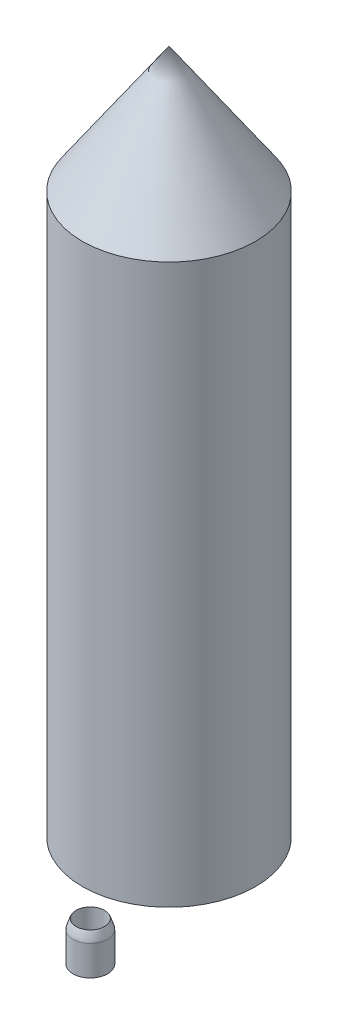
ISO-10303-21;
HEADER;
FILE_DESCRIPTION(('STEP AP214'),'2;1');
FILE_NAME('part.step','',(''),(''),'','','');
FILE_SCHEMA(('AUTOMOTIVE_DESIGN { 1 0 10303 214 1 1 1 1 }'));
ENDSEC;
DATA;
#1=APPLICATION_CONTEXT('core data for automotive mechanical design processes');
#2=APPLICATION_PROTOCOL_DEFINITION('international standard','automotive_design',2000,#1);
#3=PRODUCT_CONTEXT('',#1,'mechanical');
#4=PRODUCT('Part','Part','',(#3));
#5=PRODUCT_RELATED_PRODUCT_CATEGORY('part','',(#4));
#6=PRODUCT_DEFINITION_FORMATION('','',#4);
#7=PRODUCT_DEFINITION_CONTEXT('part definition',#1,'design');
#8=PRODUCT_DEFINITION('design','',#6,#7);
#9=PRODUCT_DEFINITION_SHAPE('','',#8);
#10=(LENGTH_UNIT() NAMED_UNIT(*) SI_UNIT(.MILLI.,.METRE.));
#11=(NAMED_UNIT(*) PLANE_ANGLE_UNIT() SI_UNIT($,.RADIAN.));
#12=(NAMED_UNIT(*) SI_UNIT($,.STERADIAN.) SOLID_ANGLE_UNIT());
#13=UNCERTAINTY_MEASURE_WITH_UNIT(LENGTH_MEASURE(1.E-05),#10,'distance_accuracy_value','');
#14=(GEOMETRIC_REPRESENTATION_CONTEXT(3) GLOBAL_UNCERTAINTY_ASSIGNED_CONTEXT((#13)) GLOBAL_UNIT_ASSIGNED_CONTEXT((#10,
#11,#12)) REPRESENTATION_CONTEXT('',''));
#15=CARTESIAN_POINT('',(0.,0.,0.));
#16=DIRECTION('',(0.,0.,1.));
#17=DIRECTION('',(1.,0.,0.));
#18=AXIS2_PLACEMENT_3D('',#15,#16,#17);
#19=CARTESIAN_POINT('',(0.,-25.,50.));
#20=DIRECTION('',(0.,-1.,0.));
#21=DIRECTION('',(0.,0.,-1.));
#22=AXIS2_PLACEMENT_3D('',#19,#20,#21);
#23=CYLINDRICAL_SURFACE('',#22,11.);
#24=CARTESIAN_POINT('',(0.,-31.0000000000006,61.));
#25=CARTESIAN_POINT('',(1.43989639291298,-31.0000000000006,61.));
#26=CARTESIAN_POINT('',(2.87922694966993,-31.0000000000009,60.7136993515129));
#27=CARTESIAN_POINT('',(5.53980856236204,-31.0000000000004,59.6116503637354));
#28=CARTESIAN_POINT('',(6.76001408941481,-31.0000000000006,58.7963350966893));
#29=CARTESIAN_POINT('',(8.7963350966893,-31.0000000000006,56.7600140894147));
#30=CARTESIAN_POINT('',(9.61165036373382,-31.0000000000006,55.5398085623658));
#31=CARTESIAN_POINT('',(10.7136993515145,-31.0000000000006,52.8792269496662));
#32=CARTESIAN_POINT('',(11.,-31.0000000000006,51.4398963929161));
#33=CARTESIAN_POINT('',(11.,-31.0000000000006,48.5601036070839));
#34=CARTESIAN_POINT('',(10.7136993515122,-31.0000000000004,47.1207730503284));
#35=CARTESIAN_POINT('',(9.61165036373608,-31.0000000000009,44.4601914376396));
#36=CARTESIAN_POINT('',(8.79633509668887,-31.0000000000006,43.2399859105848));
#37=CARTESIAN_POINT('',(6.7600140894151,-31.0000000000006,41.2036649033111));
#38=CARTESIAN_POINT('',(5.53980856236441,-31.0000000000011,40.3883496362656));
#39=CARTESIAN_POINT('',(2.87922694966758,-31.0000000000002,39.2863006484861));
#40=CARTESIAN_POINT('',(1.43989639291256,-31.0000000000006,39.));
#41=CARTESIAN_POINT('',(-1.43989639291256,-31.0000000000006,39.));
#42=CARTESIAN_POINT('',(-2.8792269496686,-31.0000000000009,39.2863006484865));
#43=CARTESIAN_POINT('',(-5.53980856236336,-31.0000000000004,40.3883496362652));
#44=CARTESIAN_POINT('',(-6.76001408941579,-31.0000000000006,41.2036649033117));
#45=CARTESIAN_POINT('',(-8.79633509668834,-31.0000000000006,43.2399859105843));
#46=CARTESIAN_POINT('',(-9.61165036373239,-31.0000000000006,44.4601914376307));
#47=CARTESIAN_POINT('',(-10.7136993515159,-31.0000000000006,47.1207730503373));
#48=CARTESIAN_POINT('',(-11.,-31.0000000000006,48.5601036070895));
#49=CARTESIAN_POINT('',(-11.,-31.0000000000006,51.4398963929105));
#50=CARTESIAN_POINT('',(-10.7136993515139,-31.0000000000004,52.8792269496677));
#51=CARTESIAN_POINT('',(-9.61165036373443,-31.0000000000009,55.5398085623643));
#52=CARTESIAN_POINT('',(-8.79633509668349,-31.0000000000006,56.7600140894206));
#53=CARTESIAN_POINT('',(-6.76001408942064,-31.0000000000006,58.7963350966834));
#54=CARTESIAN_POINT('',(-5.53980856236293,-31.0000000000006,59.611650363735));
#55=CARTESIAN_POINT('',(-2.87922694966907,-31.0000000000006,60.7136993515133));
#56=CARTESIAN_POINT('',(-1.43989639291298,-31.0000000000006,61.));
#57=CARTESIAN_POINT('',(0.,-31.0000000000006,61.));
#58=(BOUNDED_CURVE() B_SPLINE_CURVE(3,(#24,#25,#26,#27,#28,#29,#30,#31,#32,#33,#34,#35,#36,#37,
#38,#39,#40,#41,#42,#43,#44,#45,#46,#47,#48,#49,#50,#51,#52,#53,#54,#55,#56,#57),.UNSPECIFIED.,
.T.,.F.) B_SPLINE_CURVE_WITH_KNOTS((4,2,2,2,2,2,2,2,2,2,2,2,2,2,2,2,4),(0.,0.392699081698724,
0.785398163397448,1.17809724509617,1.5707963267949,1.96349540849362,2.35619449019234,
2.74889357189107,3.14159265358979,3.53429173528852,3.92699081698724,4.31968989868597,
4.71238898038469,5.10508806208341,5.49778714378214,5.89048622548086,6.28318530717959),
.UNSPECIFIED.) CURVE() GEOMETRIC_REPRESENTATION_ITEM() RATIONAL_B_SPLINE_CURVE((1.,1.,1.,1.,1.,
1.,1.,1.,1.,1.,1.,1.,1.,1.,1.,1.,1.,1.,1.,1.,1.,1.,1.,1.,1.,1.,1.,1.,1.,1.,1.,1.,1.,1.)) REPRESENTATION_ITEM(''));
#59=CARTESIAN_POINT('',(0.,-31.0000000000006,61.));
#60=VERTEX_POINT('',#59);
#61=EDGE_CURVE('E12',#60,#60,#58,.F.);
#62=ORIENTED_EDGE('',*,*,#61,.T.);
#63=EDGE_LOOP('',(#62));
#64=FACE_BOUND('',#63,.T.);
#65=CARTESIAN_POINT('',(0.,-50.,50.));
#66=DIRECTION('',(0.,1.,0.));
#67=DIRECTION('',(0.,0.,1.));
#68=AXIS2_PLACEMENT_3D('',#65,#66,#67);
#69=CIRCLE('',#68,11.);
#70=CARTESIAN_POINT('',(0.,-50.,61.));
#71=VERTEX_POINT('',#70);
#72=EDGE_CURVE('E65',#71,#71,#69,.T.);
#73=ORIENTED_EDGE('',*,*,#72,.T.);
#74=EDGE_LOOP('',(#73));
#75=FACE_BOUND('',#74,.T.);
#76=ADVANCED_FACE('F51',(#64,#75),#23,.T.);
#77=CARTESIAN_POINT('',(0.,-50.,50.));
#78=DIRECTION('',(0.,1.,0.));
#79=DIRECTION('',(0.,0.,1.));
#80=AXIS2_PLACEMENT_3D('',#77,#78,#79);
#81=PLANE('',#80);
#82=ORIENTED_EDGE('',*,*,#72,.F.);
#83=EDGE_LOOP('',(#82));
#84=FACE_BOUND('',#83,.T.);
#85=ADVANCED_FACE('F91',(#84),#81,.F.);
#86=CARTESIAN_POINT('',(0.,-25.,50.));
#87=DIRECTION('',(0.,-1.,0.));
#88=DIRECTION('',(0.,0.,-1.));
#89=AXIS2_PLACEMENT_3D('',#86,#87,#88);
#90=CYLINDRICAL_SURFACE('',#89,9.);
#91=CARTESIAN_POINT('',(0.,-25.0000000000002,58.9999999999997));
#92=CARTESIAN_POINT('',(-1.17809704874694,-25.0000000000002,58.9999999999997));
#93=CARTESIAN_POINT('',(-2.35573114063816,-25.0000000000002,58.7657540148737));
#94=CARTESIAN_POINT('',(-4.53257064193324,-25.0000000000002,57.8640775703288));
#95=CARTESIAN_POINT('',(-5.53092061861684,-25.0000000000002,57.1970014427408));
#96=CARTESIAN_POINT('',(-7.19700144274066,-25.0000000000002,55.5309206186166));
#97=CARTESIAN_POINT('',(-7.86407757032794,-25.0000000000002,54.5325706419342));
#98=CARTESIAN_POINT('',(-8.76575401487466,-25.0000000000002,52.3557311406372));
#99=CARTESIAN_POINT('',(-8.9999999999997,-25.0000000000002,51.178097048745));
#100=CARTESIAN_POINT('',(-8.9999999999997,-25.0000000000002,48.8219029512551));
#101=CARTESIAN_POINT('',(-8.76575401487636,-25.0000000000002,47.6442688593669));
#102=CARTESIAN_POINT('',(-7.86407757032624,-25.0000000000002,45.4674293580617));
#103=CARTESIAN_POINT('',(-7.19700144274477,-25.0000000000002,44.4690793813874));
#104=CARTESIAN_POINT('',(-5.53092061861272,-25.0000000000002,42.8029985572552));
#105=CARTESIAN_POINT('',(-4.53257064193349,-25.0000000000002,42.1359224296713));
#106=CARTESIAN_POINT('',(-2.35573114063789,-25.0000000000002,41.2342459851261));
#107=CARTESIAN_POINT('',(-1.1780970487466,-25.0000000000002,41.0000000000003));
#108=CARTESIAN_POINT('',(1.1780970487466,-25.0000000000002,41.0000000000003));
#109=CARTESIAN_POINT('',(2.35573114063713,-25.0000000000002,41.2342459851247));
#110=CARTESIAN_POINT('',(4.53257064193426,-25.0000000000002,42.1359224296727));
#111=CARTESIAN_POINT('',(5.53092061861215,-25.0000000000002,42.8029985572547));
#112=CARTESIAN_POINT('',(7.19700144274522,-25.0000000000002,44.4690793813878));
#113=CARTESIAN_POINT('',(7.86407757032922,-25.0000000000002,45.4674293580694));
#114=CARTESIAN_POINT('',(8.76575401487338,-25.0000000000002,47.6442688593592));
#115=CARTESIAN_POINT('',(8.9999999999997,-25.0000000000002,48.8219029512504));
#116=CARTESIAN_POINT('',(8.9999999999997,-25.0000000000002,51.1780970487496));
#117=CARTESIAN_POINT('',(8.7657540148752,-25.0000000000002,52.3557311406358));
#118=CARTESIAN_POINT('',(7.8640775703274,-25.0000000000002,54.5325706419356));
#119=CARTESIAN_POINT('',(7.19700144274552,-25.0000000000002,55.5309206186118));
#120=CARTESIAN_POINT('',(5.53092061861195,-25.0000000000002,57.1970014427456));
#121=CARTESIAN_POINT('',(4.53257064193243,-25.0000000000002,57.8640775703287));
#122=CARTESIAN_POINT('',(2.35573114063895,-25.0000000000002,58.7657540148739));
#123=CARTESIAN_POINT('',(1.17809704874694,-25.0000000000002,58.9999999999997));
#124=CARTESIAN_POINT('',(0.,-25.0000000000002,58.9999999999997));
#125=(BOUNDED_CURVE() B_SPLINE_CURVE(3,(#91,#92,#93,#94,#95,#96,#97,#98,#99,#100,#101,#102,#103,
#104,#105,#106,#107,#108,#109,#110,#111,#112,#113,#114,#115,#116,#117,#118,#119,#120,#121,#122,
#123,#124),.UNSPECIFIED.,.T.,.F.) B_SPLINE_CURVE_WITH_KNOTS((4,2,2,2,2,2,2,2,2,2,2,2,2,2,2,2,4),
(0.,0.392699081698725,0.785398163397448,1.17809724509617,1.5707963267949,1.96349540849362,
2.35619449019234,2.74889357189107,3.14159265358979,3.53429173528852,3.92699081698724,
4.31968989868597,4.71238898038469,5.10508806208341,5.49778714378214,5.89048622548086,
6.28318530717959),
.UNSPECIFIED.) CURVE() GEOMETRIC_REPRESENTATION_ITEM() RATIONAL_B_SPLINE_CURVE((1.,1.,1.,1.,1.,
1.,1.,1.,1.,1.,1.,1.,1.,1.,1.,1.,1.,1.,1.,1.,1.,1.,1.,1.,1.,1.,1.,1.,1.,1.,1.,1.,1.,1.)) REPRESENTATION_ITEM(''));
#126=CARTESIAN_POINT('',(0.,-25.0000000000002,58.9999999999997));
#127=VERTEX_POINT('',#126);
#128=EDGE_CURVE('E70',#127,#127,#125,.F.);
#129=ORIENTED_EDGE('',*,*,#128,.T.);
#130=EDGE_LOOP('',(#129));
#131=FACE_BOUND('',#130,.T.);
#132=CARTESIAN_POINT('',(0.,-48.,50.));
#133=DIRECTION('',(0.,1.,0.));
#134=DIRECTION('',(0.,0.,1.));
#135=AXIS2_PLACEMENT_3D('',#132,#133,#134);
#136=CIRCLE('',#135,9.);
#137=CARTESIAN_POINT('',(0.,-48.,59.));
#138=VERTEX_POINT('',#137);
#139=EDGE_CURVE('E75',#138,#138,#136,.T.);
#140=ORIENTED_EDGE('',*,*,#139,.F.);
#141=EDGE_LOOP('',(#140));
#142=FACE_BOUND('',#141,.T.);
#143=ADVANCED_FACE('F94',(#131,#142),#90,.F.);
#144=CARTESIAN_POINT('',(0.,-48.,50.));
#145=DIRECTION('',(0.,1.,0.));
#146=DIRECTION('',(0.,0.,1.));
#147=AXIS2_PLACEMENT_3D('',#144,#145,#146);
#148=PLANE('',#147);
#149=ORIENTED_EDGE('',*,*,#139,.T.);
#150=EDGE_LOOP('',(#149));
#151=FACE_BOUND('',#150,.T.);
#152=ADVANCED_FACE('F96',(#151),#148,.T.);
#153=CARTESIAN_POINT('',(0.,-25.0000000000002,58.9999999999997));
#154=CARTESIAN_POINT('',(1.17809704874694,-25.0000000000002,58.9999999999997));
#155=CARTESIAN_POINT('',(2.35573114063895,-25.0000000000002,58.7657540148739));
#156=CARTESIAN_POINT('',(4.53257064193243,-25.0000000000002,57.8640775703287));
#157=CARTESIAN_POINT('',(5.53092061861195,-25.0000000000002,57.1970014427456));
#158=CARTESIAN_POINT('',(7.19700144274552,-25.0000000000002,55.5309206186118));
#159=CARTESIAN_POINT('',(7.8640775703274,-25.0000000000002,54.5325706419356));
#160=CARTESIAN_POINT('',(8.7657540148752,-25.0000000000002,52.3557311406358));
#161=CARTESIAN_POINT('',(8.9999999999997,-25.0000000000002,51.1780970487496));
#162=CARTESIAN_POINT('',(8.9999999999997,-25.0000000000002,48.8219029512504));
#163=CARTESIAN_POINT('',(8.76575401487338,-25.0000000000002,47.6442688593592));
#164=CARTESIAN_POINT('',(7.86407757032922,-25.0000000000002,45.4674293580694));
#165=CARTESIAN_POINT('',(7.19700144274522,-25.0000000000002,44.4690793813878));
#166=CARTESIAN_POINT('',(5.53092061861215,-25.0000000000002,42.8029985572547));
#167=CARTESIAN_POINT('',(4.53257064193426,-25.0000000000002,42.1359224296727));
#168=CARTESIAN_POINT('',(2.35573114063713,-25.0000000000002,41.2342459851247));
#169=CARTESIAN_POINT('',(1.1780970487466,-25.0000000000002,41.0000000000003));
#170=CARTESIAN_POINT('',(-1.1780970487466,-25.0000000000002,41.0000000000003));
#171=CARTESIAN_POINT('',(-2.35573114063789,-25.0000000000002,41.2342459851261));
#172=CARTESIAN_POINT('',(-4.53257064193349,-25.0000000000002,42.1359224296713));
#173=CARTESIAN_POINT('',(-5.53092061861272,-25.0000000000002,42.8029985572552));
#174=CARTESIAN_POINT('',(-7.19700144274477,-25.0000000000002,44.4690793813874));
#175=CARTESIAN_POINT('',(-7.86407757032624,-25.0000000000002,45.4674293580617));
#176=CARTESIAN_POINT('',(-8.76575401487636,-25.0000000000002,47.6442688593669));
#177=CARTESIAN_POINT('',(-8.9999999999997,-25.0000000000002,48.8219029512551));
#178=CARTESIAN_POINT('',(-8.9999999999997,-25.0000000000002,51.178097048745));
#179=CARTESIAN_POINT('',(-8.76575401487466,-25.0000000000002,52.3557311406372));
#180=CARTESIAN_POINT('',(-7.86407757032794,-25.0000000000002,54.5325706419342));
#181=CARTESIAN_POINT('',(-7.19700144274066,-25.0000000000002,55.5309206186166));
#182=CARTESIAN_POINT('',(-5.53092061861684,-25.0000000000002,57.1970014427408));
#183=CARTESIAN_POINT('',(-4.53257064193324,-25.0000000000002,57.8640775703288));
#184=CARTESIAN_POINT('',(-2.35573114063816,-25.0000000000002,58.7657540148737));
#185=CARTESIAN_POINT('',(-1.17809704874694,-25.0000000000002,58.9999999999997));
#186=CARTESIAN_POINT('',(0.,-25.0000000000002,58.9999999999997));
#187=CARTESIAN_POINT('',(0.,-27.666666666667,61.));
#188=CARTESIAN_POINT('',(1.43989639291298,-27.666666666667,60.9999999999996));
#189=CARTESIAN_POINT('',(2.87922694966984,-27.666666666667,60.7136993515125));
#190=CARTESIAN_POINT('',(5.53980856236213,-27.666666666667,59.6116503637358));
#191=CARTESIAN_POINT('',(6.76001408941494,-27.6666666666666,58.7963350966892));
#192=CARTESIAN_POINT('',(8.79633509668916,-27.6666666666675,56.7600140894148));
#193=CARTESIAN_POINT('',(9.61165036373413,-27.6666666666666,55.5398085623662));
#194=CARTESIAN_POINT('',(10.7136993515142,-27.6666666666675,52.8792269496657));
#195=CARTESIAN_POINT('',(11.,-27.666666666667,51.4398963929161));
#196=CARTESIAN_POINT('',(11.,-27.666666666667,48.5601036070839));
#197=CARTESIAN_POINT('',(10.7136993515121,-27.666666666667,47.1207730503279));
#198=CARTESIAN_POINT('',(9.61165036373617,-27.666666666667,44.4601914376401));
#199=CARTESIAN_POINT('',(8.79633509668875,-27.666666666667,43.2399859105844));
#200=CARTESIAN_POINT('',(6.76001408941522,-27.666666666667,41.2036649033115));
#201=CARTESIAN_POINT('',(5.5398085623645,-27.666666666667,40.3883496362657));
#202=CARTESIAN_POINT('',(2.87922694966749,-27.666666666667,39.2863006484861));
#203=CARTESIAN_POINT('',(1.43989639291256,-27.666666666667,39.));
#204=CARTESIAN_POINT('',(-1.43989639291256,-27.666666666667,39.));
#205=CARTESIAN_POINT('',(-2.87922694966867,-27.6666666666673,39.2863006484865));
#206=CARTESIAN_POINT('',(-5.5398085623633,-27.6666666666668,40.3883496362652));
#207=CARTESIAN_POINT('',(-6.76001408941615,-27.6666666666672,41.2036649033111));
#208=CARTESIAN_POINT('',(-8.79633509668797,-27.6666666666668,43.2399859105849));
#209=CARTESIAN_POINT('',(-9.61165036373255,-27.6666666666672,44.4601914376303));
#210=CARTESIAN_POINT('',(-10.7136993515158,-27.6666666666668,47.1207730503378));
#211=CARTESIAN_POINT('',(-10.9999999999995,-27.6666666666672,48.5601036070895));
#212=CARTESIAN_POINT('',(-11.0000000000005,-27.6666666666668,51.4398963929105));
#213=CARTESIAN_POINT('',(-10.7136993515141,-27.6666666666675,52.8792269496677));
#214=CARTESIAN_POINT('',(-9.61165036373426,-27.6666666666666,55.5398085623643));
#215=CARTESIAN_POINT('',(-8.79633509668321,-27.6666666666672,56.7600140894206));
#216=CARTESIAN_POINT('',(-6.76001408942092,-27.6666666666668,58.7963350966834));
#217=CARTESIAN_POINT('',(-5.53980856236307,-27.6666666666666,59.6116503637355));
#218=CARTESIAN_POINT('',(-2.87922694966894,-27.6666666666675,60.7136993515128));
#219=CARTESIAN_POINT('',(-1.43989639291298,-27.666666666667,61.0000000000005));
#220=CARTESIAN_POINT('',(0.,-27.666666666667,61.));
#221=CARTESIAN_POINT('',(0.,-31.0000000000006,61.));
#222=CARTESIAN_POINT('',(1.43989639291298,-31.0000000000006,61.));
#223=CARTESIAN_POINT('',(2.87922694966993,-31.0000000000009,60.7136993515129));
#224=CARTESIAN_POINT('',(5.53980856236204,-31.0000000000004,59.6116503637354));
#225=CARTESIAN_POINT('',(6.76001408941481,-31.0000000000006,58.7963350966893));
#226=CARTESIAN_POINT('',(8.7963350966893,-31.0000000000006,56.7600140894147));
#227=CARTESIAN_POINT('',(9.61165036373382,-31.0000000000006,55.5398085623658));
#228=CARTESIAN_POINT('',(10.7136993515145,-31.0000000000006,52.8792269496662));
#229=CARTESIAN_POINT('',(11.,-31.0000000000006,51.4398963929161));
#230=CARTESIAN_POINT('',(11.,-31.0000000000006,48.5601036070839));
#231=CARTESIAN_POINT('',(10.7136993515122,-31.0000000000004,47.1207730503284));
#232=CARTESIAN_POINT('',(9.61165036373608,-31.0000000000009,44.4601914376396));
#233=CARTESIAN_POINT('',(8.79633509668887,-31.0000000000006,43.2399859105848));
#234=CARTESIAN_POINT('',(6.7600140894151,-31.0000000000006,41.2036649033111));
#235=CARTESIAN_POINT('',(5.53980856236441,-31.0000000000011,40.3883496362656));
#236=CARTESIAN_POINT('',(2.87922694966758,-31.0000000000002,39.2863006484861));
#237=CARTESIAN_POINT('',(1.43989639291256,-31.0000000000006,39.));
#238=CARTESIAN_POINT('',(-1.43989639291256,-31.0000000000006,39.));
#239=CARTESIAN_POINT('',(-2.8792269496686,-31.0000000000009,39.2863006484865));
#240=CARTESIAN_POINT('',(-5.53980856236336,-31.0000000000004,40.3883496362652));
#241=CARTESIAN_POINT('',(-6.76001408941579,-31.0000000000006,41.2036649033117));
#242=CARTESIAN_POINT('',(-8.79633509668834,-31.0000000000006,43.2399859105843));
#243=CARTESIAN_POINT('',(-9.61165036373239,-31.0000000000006,44.4601914376307));
#244=CARTESIAN_POINT('',(-10.7136993515159,-31.0000000000006,47.1207730503373));
#245=CARTESIAN_POINT('',(-11.,-31.0000000000006,48.5601036070895));
#246=CARTESIAN_POINT('',(-11.,-31.0000000000006,51.4398963929105));
#247=CARTESIAN_POINT('',(-10.7136993515139,-31.0000000000004,52.8792269496677));
#248=CARTESIAN_POINT('',(-9.61165036373443,-31.0000000000009,55.5398085623643));
#249=CARTESIAN_POINT('',(-8.79633509668349,-31.0000000000006,56.7600140894206));
#250=CARTESIAN_POINT('',(-6.76001408942064,-31.0000000000006,58.7963350966834));
#251=CARTESIAN_POINT('',(-5.53980856236293,-31.0000000000006,59.611650363735));
#252=CARTESIAN_POINT('',(-2.87922694966907,-31.0000000000006,60.7136993515133));
#253=CARTESIAN_POINT('',(-1.43989639291298,-31.0000000000006,61.));
#254=CARTESIAN_POINT('',(0.,-31.0000000000006,61.));
#255=(BOUNDED_SURFACE() B_SPLINE_SURFACE(2,3,((#153,#154,#155,#156,#157,#158,#159,#160,#161,
#162,#163,#164,#165,#166,#167,#168,#169,#170,#171,#172,#173,#174,#175,#176,#177,#178,#179,#180,
#181,#182,#183,#184,#185,#186),(#187,#188,#189,#190,#191,#192,#193,#194,#195,#196,#197,#198,
#199,#200,#201,#202,#203,#204,#205,#206,#207,#208,#209,#210,#211,#212,#213,#214,#215,#216,#217,
#218,#219,#220),(#221,#222,#223,#224,#225,#226,#227,#228,#229,#230,#231,#232,#233,#234,#235,
#236,#237,#238,#239,#240,#241,#242,#243,#244,#245,#246,#247,#248,#249,#250,#251,#252,#253,
#254)),.UNSPECIFIED.,.F.,.T.,.F.) B_SPLINE_SURFACE_WITH_KNOTS((3,3),(4,2,2,2,2,2,2,2,2,2,2,2,2,
2,2,2,4),(0.,1.),(0.,0.392699081698724,0.785398163397448,1.17809724509617,1.5707963267949,
1.96349540849362,2.35619449019234,2.74889357189107,3.14159265358979,3.53429173528852,
3.92699081698724,4.31968989868597,4.71238898038469,5.10508806208341,5.49778714378214,
5.89048622548086,6.28318530717959),
.UNSPECIFIED.) GEOMETRIC_REPRESENTATION_ITEM() RATIONAL_B_SPLINE_SURFACE(((1.,1.,1.,1.,1.,1.,1.,
1.,1.,1.,1.,1.,1.,1.,1.,1.,1.,1.,1.,1.,1.,1.,1.,1.,1.,1.,1.,1.,1.,1.,1.,1.,1.,1.),
(0.237170824512626,0.237170824512626,0.237170824512626,0.237170824512626,0.237170824512626,
0.237170824512626,0.237170824512626,0.237170824512626,0.237170824512626,0.237170824512626,
0.237170824512626,0.237170824512626,0.237170824512626,0.237170824512626,0.237170824512626,
0.237170824512626,0.237170824512626,0.237170824512626,0.237170824512627,0.237170824512627,
0.237170824512626,0.237170824512626,0.237170824512626,0.237170824512626,0.237170824512626,
0.237170824512626,0.237170824512626,0.237170824512626,0.237170824512626,0.237170824512626,
0.237170824512626,0.237170824512626,0.237170824512626,0.237170824512626),(1.,1.,1.,1.,1.,1.,1.,
1.,1.,1.,1.,1.,1.,1.,1.,1.,1.,1.,1.,1.,1.,1.,1.,1.,1.,1.,1.,1.,1.,1.,1.,1.,1.,1.))) REPRESENTATION_ITEM('') SURFACE());
#256=ORIENTED_EDGE('',*,*,#61,.F.);
#257=EDGE_LOOP('',(#256));
#258=FACE_BOUND('',#257,.T.);
#259=ORIENTED_EDGE('',*,*,#128,.F.);
#260=EDGE_LOOP('',(#259));
#261=FACE_BOUND('',#260,.T.);
#262=ADVANCED_FACE('F54',(#258,#261),#255,.T.);
#263=CLOSED_SHELL('',(#76,#85,#143,#152,#262));
#264=MANIFOLD_SOLID_BREP('B2',#263);
#265=CARTESIAN_POINT('',(0.,350.,0.));
#266=DIRECTION('',(0.,-1.,0.));
#267=DIRECTION('',(0.,0.,-1.));
#268=AXIS2_PLACEMENT_3D('',#265,#266,#267);
#269=CYLINDRICAL_SURFACE('',#268,55.);
#270=CARTESIAN_POINT('',(0.,350.,0.));
#271=DIRECTION('',(0.,1.,0.));
#272=DIRECTION('',(0.,0.,1.));
#273=AXIS2_PLACEMENT_3D('',#270,#271,#272);
#274=CIRCLE('',#273,55.);
#275=CARTESIAN_POINT('',(0.,350.,55.));
#276=VERTEX_POINT('',#275);
#277=EDGE_CURVE('E49',#276,#276,#274,.T.);
#278=ORIENTED_EDGE('',*,*,#277,.F.);
#279=EDGE_LOOP('',(#278));
#280=FACE_BOUND('',#279,.T.);
#281=CARTESIAN_POINT('',(0.,-5.,0.));
#282=DIRECTION('',(0.,1.,0.));
#283=DIRECTION('',(0.,0.,1.));
#284=AXIS2_PLACEMENT_3D('',#281,#282,#283);
#285=CIRCLE('',#284,55.);
#286=CARTESIAN_POINT('',(0.,-5.,55.));
#287=VERTEX_POINT('',#286);
#288=EDGE_CURVE('E194',#287,#287,#285,.T.);
#289=ORIENTED_EDGE('',*,*,#288,.T.);
#290=EDGE_LOOP('',(#289));
#291=FACE_BOUND('',#290,.T.);
#292=ADVANCED_FACE('F186',(#280,#291),#269,.T.);
#293=CARTESIAN_POINT('',(0.,-5.,0.));
#294=DIRECTION('',(0.,1.,0.));
#295=DIRECTION('',(0.,0.,1.));
#296=AXIS2_PLACEMENT_3D('',#293,#294,#295);
#297=PLANE('',#296);
#298=ORIENTED_EDGE('',*,*,#288,.F.);
#299=EDGE_LOOP('',(#298));
#300=FACE_BOUND('',#299,.T.);
#301=ADVANCED_FACE('F188',(#300),#297,.F.);
#302=CARTESIAN_POINT('',(0.,430.,0.));
#303=DIRECTION('',(0.,-1.,0.));
#304=DIRECTION('',(0.,0.,-1.));
#305=AXIS2_PLACEMENT_3D('',#302,#303,#304);
#306=CONICAL_SURFACE('',#305,0.,0.602287346134964);
#307=ORIENTED_EDGE('',*,*,#277,.T.);
#308=EDGE_LOOP('',(#307));
#309=FACE_BOUND('',#308,.T.);
#310=CARTESIAN_POINT('',(0.,430.,0.));
#311=VERTEX_POINT('',#310);
#312=VERTEX_LOOP('',#311);
#313=FACE_BOUND('',#312,.T.);
#314=ADVANCED_FACE('F197',(#309,#313),#306,.T.);
#315=CLOSED_SHELL('',(#292,#301,#314));
#316=CARTESIAN_POINT('',(0.,0.,0.));
#317=DIRECTION('',(0.,1.,0.));
#318=DIRECTION('',(0.,0.,1.));
#319=AXIS2_PLACEMENT_3D('',#316,#317,#318);
#320=PLANE('',#319);
#321=CARTESIAN_POINT('',(0.,0.,0.));
#322=DIRECTION('',(0.,1.,0.));
#323=DIRECTION('',(0.,0.,1.));
#324=AXIS2_PLACEMENT_3D('',#321,#322,#323);
#325=CIRCLE('',#324,50.);
#326=CARTESIAN_POINT('',(0.,0.,50.));
#327=VERTEX_POINT('',#326);
#328=EDGE_CURVE('E229',#327,#327,#325,.T.);
#329=ORIENTED_EDGE('',*,*,#328,.T.);
#330=EDGE_LOOP('',(#329));
#331=FACE_BOUND('',#330,.T.);
#332=ADVANCED_FACE('F218',(#331),#320,.T.);
#333=CARTESIAN_POINT('',(0.,350.,0.));
#334=DIRECTION('',(0.,-1.,0.));
#335=DIRECTION('',(0.,0.,-1.));
#336=AXIS2_PLACEMENT_3D('',#333,#334,#335);
#337=CYLINDRICAL_SURFACE('',#336,50.);
#338=CARTESIAN_POINT('',(0.,350.,0.));
#339=DIRECTION('',(0.,1.,0.));
#340=DIRECTION('',(0.,0.,1.));
#341=AXIS2_PLACEMENT_3D('',#338,#339,#340);
#342=CIRCLE('',#341,50.);
#343=CARTESIAN_POINT('',(0.,350.,50.));
#344=VERTEX_POINT('',#343);
#345=EDGE_CURVE('E228',#344,#344,#342,.T.);
#346=ORIENTED_EDGE('',*,*,#345,.T.);
#347=EDGE_LOOP('',(#346));
#348=FACE_BOUND('',#347,.T.);
#349=ORIENTED_EDGE('',*,*,#328,.F.);
#350=EDGE_LOOP('',(#349));
#351=FACE_BOUND('',#350,.T.);
#352=ADVANCED_FACE('F214',(#348,#351),#337,.F.);
#353=CARTESIAN_POINT('',(-55.,350.,0.));
#354=DIRECTION('',(0.,1.,0.));
#355=DIRECTION('',(0.,0.,1.));
#356=AXIS2_PLACEMENT_3D('',#353,#354,#355);
#357=PLANE('',#356);
#358=ORIENTED_EDGE('',*,*,#345,.F.);
#359=EDGE_LOOP('',(#358));
#360=FACE_BOUND('',#359,.T.);
#361=ADVANCED_FACE('F217',(#360),#357,.F.);
#362=CLOSED_SHELL('',(#332,#352,#361));
#363=ORIENTED_CLOSED_SHELL('',*,#362,.T.);
#364=BREP_WITH_VOIDS('B7',#315,(#363));
#365=ADVANCED_BREP_SHAPE_REPRESENTATION('',(#18,#264,#364),#14);
#366=SHAPE_DEFINITION_REPRESENTATION(#9,#365);
ENDSEC;
END-ISO-10303-21;
